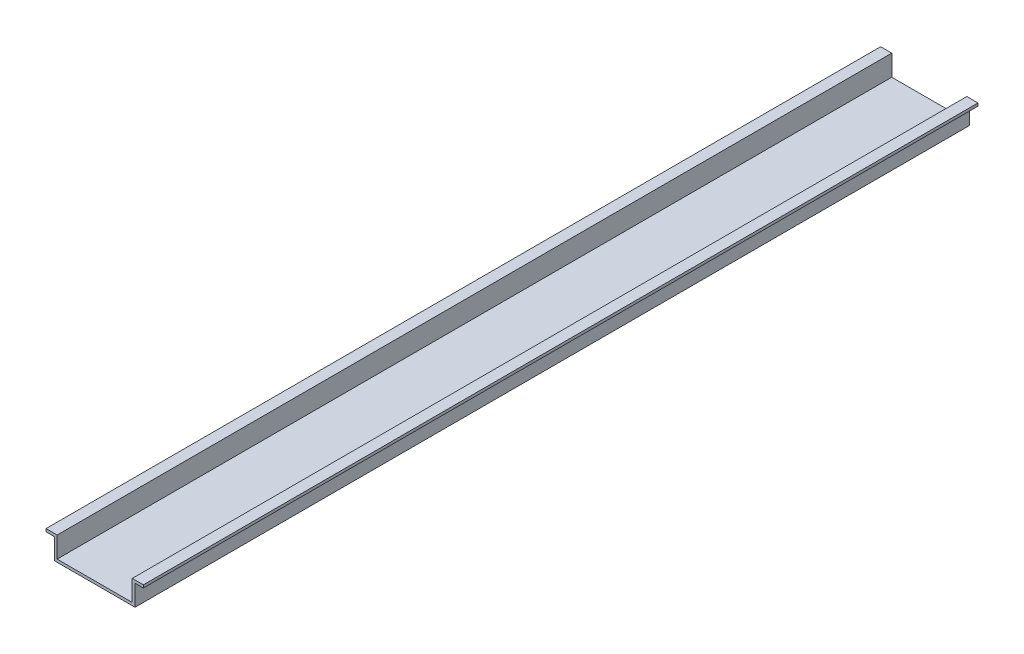
ISO-10303-21;
HEADER;
FILE_DESCRIPTION(('STEP AP214'),'2;1');
FILE_NAME('part.step','',(''),(''),'','','');
FILE_SCHEMA(('AUTOMOTIVE_DESIGN { 1 0 10303 214 1 1 1 1 }'));
ENDSEC;
DATA;
#1=APPLICATION_CONTEXT('core data for automotive mechanical design processes');
#2=APPLICATION_PROTOCOL_DEFINITION('international standard','automotive_design',2000,#1);
#3=PRODUCT_CONTEXT('',#1,'mechanical');
#4=PRODUCT('Part','Part','',(#3));
#5=PRODUCT_RELATED_PRODUCT_CATEGORY('part','',(#4));
#6=PRODUCT_DEFINITION_FORMATION('','',#4);
#7=PRODUCT_DEFINITION_CONTEXT('part definition',#1,'design');
#8=PRODUCT_DEFINITION('design','',#6,#7);
#9=PRODUCT_DEFINITION_SHAPE('','',#8);
#10=(LENGTH_UNIT() NAMED_UNIT(*) SI_UNIT(.MILLI.,.METRE.));
#11=(NAMED_UNIT(*) PLANE_ANGLE_UNIT() SI_UNIT($,.RADIAN.));
#12=(NAMED_UNIT(*) SI_UNIT($,.STERADIAN.) SOLID_ANGLE_UNIT());
#13=UNCERTAINTY_MEASURE_WITH_UNIT(LENGTH_MEASURE(1.E-05),#10,'distance_accuracy_value','');
#14=(GEOMETRIC_REPRESENTATION_CONTEXT(3) GLOBAL_UNCERTAINTY_ASSIGNED_CONTEXT((#13)) GLOBAL_UNIT_ASSIGNED_CONTEXT((#10,
#11,#12)) REPRESENTATION_CONTEXT('',''));
#15=CARTESIAN_POINT('',(0.,0.,0.));
#16=DIRECTION('',(0.,0.,1.));
#17=DIRECTION('',(1.,0.,0.));
#18=AXIS2_PLACEMENT_3D('',#15,#16,#17);
#19=CARTESIAN_POINT('',(13.5,6.49999999999999,150.));
#20=DIRECTION('',(0.,1.,0.));
#21=DIRECTION('',(-1.,0.,0.));
#22=AXIS2_PLACEMENT_3D('',#19,#20,#21);
#23=PLANE('',#22);
#24=DIRECTION('',(1.,0.,0.));
#25=VECTOR('',#24,1.);
#26=CARTESIAN_POINT('',(13.5,6.49999999999999,-150.));
#27=LINE('',#26,#25);
#28=CARTESIAN_POINT('',(14.5,6.49999999999999,-150.));
#29=VERTEX_POINT('',#28);
#30=CARTESIAN_POINT('',(17.5,6.49999999999999,-150.));
#31=VERTEX_POINT('',#30);
#32=EDGE_CURVE('E157',#29,#31,#27,.T.);
#33=ORIENTED_EDGE('',*,*,#32,.T.);
#34=DIRECTION('',(0.,0.,-1.));
#35=VECTOR('',#34,1.);
#36=CARTESIAN_POINT('',(17.5,6.49999999999999,150.));
#37=LINE('',#36,#35);
#38=CARTESIAN_POINT('',(17.5,6.49999999999999,150.));
#39=VERTEX_POINT('',#38);
#40=EDGE_CURVE('E11',#39,#31,#37,.T.);
#41=ORIENTED_EDGE('',*,*,#40,.F.);
#42=DIRECTION('',(1.,0.,0.));
#43=VECTOR('',#42,1.);
#44=CARTESIAN_POINT('',(13.5,6.49999999999999,150.));
#45=LINE('',#44,#43);
#46=CARTESIAN_POINT('',(14.5,6.49999999999999,150.));
#47=VERTEX_POINT('',#46);
#48=EDGE_CURVE('E105',#47,#39,#45,.T.);
#49=ORIENTED_EDGE('',*,*,#48,.F.);
#50=DIRECTION('',(0.,0.,-1.));
#51=VECTOR('',#50,1.);
#52=CARTESIAN_POINT('',(14.5,6.49999999999999,150.));
#53=LINE('',#52,#51);
#54=EDGE_CURVE('E153',#47,#29,#53,.T.);
#55=ORIENTED_EDGE('',*,*,#54,.T.);
#56=EDGE_LOOP('',(#33,#41,#49,#55));
#57=FACE_BOUND('',#56,.T.);
#58=ADVANCED_FACE('F37',(#57),#23,.F.);
#59=CARTESIAN_POINT('',(17.5,7.49999999999999,150.));
#60=DIRECTION('',(1.,0.,0.));
#61=DIRECTION('',(0.,0.,-1.));
#62=AXIS2_PLACEMENT_3D('',#59,#60,#61);
#63=PLANE('',#62);
#64=DIRECTION('',(0.,-1.,0.));
#65=VECTOR('',#64,1.);
#66=CARTESIAN_POINT('',(17.5,7.49999999999999,-150.));
#67=LINE('',#66,#65);
#68=CARTESIAN_POINT('',(17.5,7.49999999999999,-150.));
#69=VERTEX_POINT('',#68);
#70=EDGE_CURVE('E160',#69,#31,#67,.T.);
#71=ORIENTED_EDGE('',*,*,#70,.F.);
#72=DIRECTION('',(0.,0.,-1.));
#73=VECTOR('',#72,1.);
#74=CARTESIAN_POINT('',(17.5,7.49999999999999,150.));
#75=LINE('',#74,#73);
#76=CARTESIAN_POINT('',(17.5,7.49999999999999,150.));
#77=VERTEX_POINT('',#76);
#78=EDGE_CURVE('E45',#77,#69,#75,.T.);
#79=ORIENTED_EDGE('',*,*,#78,.F.);
#80=DIRECTION('',(0.,-1.,0.));
#81=VECTOR('',#80,1.);
#82=CARTESIAN_POINT('',(17.5,7.49999999999999,150.));
#83=LINE('',#82,#81);
#84=EDGE_CURVE('E222',#77,#39,#83,.T.);
#85=ORIENTED_EDGE('',*,*,#84,.T.);
#86=ORIENTED_EDGE('',*,*,#40,.T.);
#87=EDGE_LOOP('',(#71,#79,#85,#86));
#88=FACE_BOUND('',#87,.T.);
#89=ADVANCED_FACE('F209',(#88),#63,.T.);
#90=CARTESIAN_POINT('',(13.5,7.49999999999999,150.));
#91=DIRECTION('',(0.,1.,0.));
#92=DIRECTION('',(-1.,0.,0.));
#93=AXIS2_PLACEMENT_3D('',#90,#91,#92);
#94=PLANE('',#93);
#95=DIRECTION('',(1.,0.,0.));
#96=VECTOR('',#95,1.);
#97=CARTESIAN_POINT('',(13.5,7.49999999999999,-150.));
#98=LINE('',#97,#96);
#99=CARTESIAN_POINT('',(13.5,7.49999999999999,-150.));
#100=VERTEX_POINT('',#99);
#101=EDGE_CURVE('E163',#100,#69,#98,.T.);
#102=ORIENTED_EDGE('',*,*,#101,.F.);
#103=DIRECTION('',(0.,0.,-1.));
#104=VECTOR('',#103,1.);
#105=CARTESIAN_POINT('',(13.5,7.49999999999999,150.));
#106=LINE('',#105,#104);
#107=CARTESIAN_POINT('',(13.5,7.49999999999999,150.));
#108=VERTEX_POINT('',#107);
#109=EDGE_CURVE('E199',#108,#100,#106,.T.);
#110=ORIENTED_EDGE('',*,*,#109,.F.);
#111=DIRECTION('',(1.,0.,0.));
#112=VECTOR('',#111,1.);
#113=CARTESIAN_POINT('',(13.5,7.49999999999999,150.));
#114=LINE('',#113,#112);
#115=EDGE_CURVE('E206',#108,#77,#114,.T.);
#116=ORIENTED_EDGE('',*,*,#115,.T.);
#117=ORIENTED_EDGE('',*,*,#78,.T.);
#118=EDGE_LOOP('',(#102,#110,#116,#117));
#119=FACE_BOUND('',#118,.T.);
#120=ADVANCED_FACE('F204',(#119),#94,.T.);
#121=CARTESIAN_POINT('',(13.5,0.,150.));
#122=DIRECTION('',(-1.,0.,0.));
#123=DIRECTION('',(0.,0.,1.));
#124=AXIS2_PLACEMENT_3D('',#121,#122,#123);
#125=PLANE('',#124);
#126=DIRECTION('',(0.,1.,0.));
#127=VECTOR('',#126,1.);
#128=CARTESIAN_POINT('',(13.5,0.,-150.));
#129=LINE('',#128,#127);
#130=CARTESIAN_POINT('',(13.5,0.,-150.));
#131=VERTEX_POINT('',#130);
#132=EDGE_CURVE('E166',#131,#100,#129,.T.);
#133=ORIENTED_EDGE('',*,*,#132,.F.);
#134=DIRECTION('',(0.,0.,-1.));
#135=VECTOR('',#134,1.);
#136=CARTESIAN_POINT('',(13.5,0.,150.));
#137=LINE('',#136,#135);
#138=CARTESIAN_POINT('',(13.5,0.,150.));
#139=VERTEX_POINT('',#138);
#140=EDGE_CURVE('E197',#139,#131,#137,.T.);
#141=ORIENTED_EDGE('',*,*,#140,.F.);
#142=DIRECTION('',(0.,1.,0.));
#143=VECTOR('',#142,1.);
#144=CARTESIAN_POINT('',(13.5,0.,150.));
#145=LINE('',#144,#143);
#146=EDGE_CURVE('E219',#139,#108,#145,.T.);
#147=ORIENTED_EDGE('',*,*,#146,.T.);
#148=ORIENTED_EDGE('',*,*,#109,.T.);
#149=EDGE_LOOP('',(#133,#141,#147,#148));
#150=FACE_BOUND('',#149,.T.);
#151=ADVANCED_FACE('F216',(#150),#125,.T.);
#152=CARTESIAN_POINT('',(13.5,0.,150.));
#153=DIRECTION('',(0.,1.,0.));
#154=DIRECTION('',(0.,0.,1.));
#155=AXIS2_PLACEMENT_3D('',#152,#153,#154);
#156=PLANE('',#155);
#157=DIRECTION('',(1.,0.,0.));
#158=VECTOR('',#157,1.);
#159=CARTESIAN_POINT('',(13.5,0.,-150.));
#160=LINE('',#159,#158);
#161=CARTESIAN_POINT('',(-13.5,0.,-150.));
#162=VERTEX_POINT('',#161);
#163=EDGE_CURVE('E169',#162,#131,#160,.T.);
#164=ORIENTED_EDGE('',*,*,#163,.F.);
#165=DIRECTION('',(0.,0.,-1.));
#166=VECTOR('',#165,1.);
#167=CARTESIAN_POINT('',(-13.5,0.,150.));
#168=LINE('',#167,#166);
#169=CARTESIAN_POINT('',(-13.5,0.,150.));
#170=VERTEX_POINT('',#169);
#171=EDGE_CURVE('E195',#170,#162,#168,.T.);
#172=ORIENTED_EDGE('',*,*,#171,.F.);
#173=DIRECTION('',(1.,0.,0.));
#174=VECTOR('',#173,1.);
#175=CARTESIAN_POINT('',(13.5,0.,150.));
#176=LINE('',#175,#174);
#177=EDGE_CURVE('E224',#170,#139,#176,.T.);
#178=ORIENTED_EDGE('',*,*,#177,.T.);
#179=ORIENTED_EDGE('',*,*,#140,.T.);
#180=EDGE_LOOP('',(#164,#172,#178,#179));
#181=FACE_BOUND('',#180,.T.);
#182=ADVANCED_FACE('F331',(#181),#156,.T.);
#183=CARTESIAN_POINT('',(-13.5,0.,150.));
#184=DIRECTION('',(1.,0.,0.));
#185=DIRECTION('',(0.,0.,-1.));
#186=AXIS2_PLACEMENT_3D('',#183,#184,#185);
#187=PLANE('',#186);
#188=DIRECTION('',(0.,-1.,0.));
#189=VECTOR('',#188,1.);
#190=CARTESIAN_POINT('',(-13.5,0.,-150.));
#191=LINE('',#190,#189);
#192=CARTESIAN_POINT('',(-13.5,7.49999999999999,-150.));
#193=VERTEX_POINT('',#192);
#194=EDGE_CURVE('E172',#193,#162,#191,.T.);
#195=ORIENTED_EDGE('',*,*,#194,.F.);
#196=DIRECTION('',(0.,0.,-1.));
#197=VECTOR('',#196,1.);
#198=CARTESIAN_POINT('',(-13.5,7.49999999999999,150.));
#199=LINE('',#198,#197);
#200=CARTESIAN_POINT('',(-13.5,7.49999999999999,150.));
#201=VERTEX_POINT('',#200);
#202=EDGE_CURVE('E193',#201,#193,#199,.T.);
#203=ORIENTED_EDGE('',*,*,#202,.F.);
#204=DIRECTION('',(0.,-1.,0.));
#205=VECTOR('',#204,1.);
#206=CARTESIAN_POINT('',(-13.5,0.,150.));
#207=LINE('',#206,#205);
#208=EDGE_CURVE('E230',#201,#170,#207,.T.);
#209=ORIENTED_EDGE('',*,*,#208,.T.);
#210=ORIENTED_EDGE('',*,*,#171,.T.);
#211=EDGE_LOOP('',(#195,#203,#209,#210));
#212=FACE_BOUND('',#211,.T.);
#213=ADVANCED_FACE('F321',(#212),#187,.T.);
#214=CARTESIAN_POINT('',(-13.5,7.49999999999999,150.));
#215=DIRECTION('',(0.,1.,0.));
#216=DIRECTION('',(-1.,0.,0.));
#217=AXIS2_PLACEMENT_3D('',#214,#215,#216);
#218=PLANE('',#217);
#219=DIRECTION('',(1.,0.,0.));
#220=VECTOR('',#219,1.);
#221=CARTESIAN_POINT('',(-13.5,7.49999999999999,-150.));
#222=LINE('',#221,#220);
#223=CARTESIAN_POINT('',(-17.5,7.49999999999999,-150.));
#224=VERTEX_POINT('',#223);
#225=EDGE_CURVE('E175',#224,#193,#222,.T.);
#226=ORIENTED_EDGE('',*,*,#225,.F.);
#227=DIRECTION('',(0.,0.,-1.));
#228=VECTOR('',#227,1.);
#229=CARTESIAN_POINT('',(-17.5,7.49999999999999,150.));
#230=LINE('',#229,#228);
#231=CARTESIAN_POINT('',(-17.5,7.49999999999999,150.));
#232=VERTEX_POINT('',#231);
#233=EDGE_CURVE('E191',#232,#224,#230,.T.);
#234=ORIENTED_EDGE('',*,*,#233,.F.);
#235=DIRECTION('',(1.,0.,0.));
#236=VECTOR('',#235,1.);
#237=CARTESIAN_POINT('',(-13.5,7.49999999999999,150.));
#238=LINE('',#237,#236);
#239=EDGE_CURVE('E233',#232,#201,#238,.T.);
#240=ORIENTED_EDGE('',*,*,#239,.T.);
#241=ORIENTED_EDGE('',*,*,#202,.T.);
#242=EDGE_LOOP('',(#226,#234,#240,#241));
#243=FACE_BOUND('',#242,.T.);
#244=ADVANCED_FACE('F245',(#243),#218,.T.);
#245=CARTESIAN_POINT('',(-17.5,6.49999999999999,150.));
#246=DIRECTION('',(-1.,0.,0.));
#247=DIRECTION('',(0.,0.,1.));
#248=AXIS2_PLACEMENT_3D('',#245,#246,#247);
#249=PLANE('',#248);
#250=DIRECTION('',(0.,1.,0.));
#251=VECTOR('',#250,1.);
#252=CARTESIAN_POINT('',(-17.5,6.49999999999999,-150.));
#253=LINE('',#252,#251);
#254=CARTESIAN_POINT('',(-17.5,6.49999999999999,-150.));
#255=VERTEX_POINT('',#254);
#256=EDGE_CURVE('E178',#255,#224,#253,.T.);
#257=ORIENTED_EDGE('',*,*,#256,.F.);
#258=DIRECTION('',(0.,0.,-1.));
#259=VECTOR('',#258,1.);
#260=CARTESIAN_POINT('',(-17.5,6.49999999999999,150.));
#261=LINE('',#260,#259);
#262=CARTESIAN_POINT('',(-17.5,6.49999999999999,150.));
#263=VERTEX_POINT('',#262);
#264=EDGE_CURVE('E189',#263,#255,#261,.T.);
#265=ORIENTED_EDGE('',*,*,#264,.F.);
#266=DIRECTION('',(0.,1.,0.));
#267=VECTOR('',#266,1.);
#268=CARTESIAN_POINT('',(-17.5,6.49999999999999,150.));
#269=LINE('',#268,#267);
#270=EDGE_CURVE('E236',#263,#232,#269,.T.);
#271=ORIENTED_EDGE('',*,*,#270,.T.);
#272=ORIENTED_EDGE('',*,*,#233,.T.);
#273=EDGE_LOOP('',(#257,#265,#271,#272));
#274=FACE_BOUND('',#273,.T.);
#275=ADVANCED_FACE('F240',(#274),#249,.T.);
#276=CARTESIAN_POINT('',(-13.5,6.49999999999999,150.));
#277=DIRECTION('',(0.,1.,0.));
#278=DIRECTION('',(-1.,0.,0.));
#279=AXIS2_PLACEMENT_3D('',#276,#277,#278);
#280=PLANE('',#279);
#281=DIRECTION('',(1.,0.,0.));
#282=VECTOR('',#281,1.);
#283=CARTESIAN_POINT('',(-13.5,6.49999999999999,-150.));
#284=LINE('',#283,#282);
#285=CARTESIAN_POINT('',(-14.5,6.49999999999999,-150.));
#286=VERTEX_POINT('',#285);
#287=EDGE_CURVE('E181',#255,#286,#284,.T.);
#288=ORIENTED_EDGE('',*,*,#287,.T.);
#289=DIRECTION('',(0.,0.,-1.));
#290=VECTOR('',#289,1.);
#291=CARTESIAN_POINT('',(-14.5,6.49999999999999,150.));
#292=LINE('',#291,#290);
#293=CARTESIAN_POINT('',(-14.5,6.49999999999999,150.));
#294=VERTEX_POINT('',#293);
#295=EDGE_CURVE('E148',#294,#286,#292,.T.);
#296=ORIENTED_EDGE('',*,*,#295,.F.);
#297=DIRECTION('',(1.,0.,0.));
#298=VECTOR('',#297,1.);
#299=CARTESIAN_POINT('',(-13.5,6.49999999999999,150.));
#300=LINE('',#299,#298);
#301=EDGE_CURVE('E139',#263,#294,#300,.T.);
#302=ORIENTED_EDGE('',*,*,#301,.F.);
#303=ORIENTED_EDGE('',*,*,#264,.T.);
#304=EDGE_LOOP('',(#288,#296,#302,#303));
#305=FACE_BOUND('',#304,.T.);
#306=ADVANCED_FACE('F249',(#305),#280,.F.);
#307=CARTESIAN_POINT('',(-14.5,0.,150.));
#308=DIRECTION('',(1.,0.,0.));
#309=DIRECTION('',(0.,0.,-1.));
#310=AXIS2_PLACEMENT_3D('',#307,#308,#309);
#311=PLANE('',#310);
#312=DIRECTION('',(0.,1.,0.));
#313=VECTOR('',#312,1.);
#314=CARTESIAN_POINT('',(-14.5,0.,-150.));
#315=LINE('',#314,#313);
#316=CARTESIAN_POINT('',(-14.5,-1.,-150.));
#317=VERTEX_POINT('',#316);
#318=EDGE_CURVE('E147',#286,#317,#315,.F.);
#319=ORIENTED_EDGE('',*,*,#318,.T.);
#320=DIRECTION('',(0.,0.,-1.));
#321=VECTOR('',#320,1.);
#322=CARTESIAN_POINT('',(-14.5,-1.,150.));
#323=LINE('',#322,#321);
#324=CARTESIAN_POINT('',(-14.5,-1.,150.));
#325=VERTEX_POINT('',#324);
#326=EDGE_CURVE('E144',#325,#317,#323,.T.);
#327=ORIENTED_EDGE('',*,*,#326,.F.);
#328=DIRECTION('',(0.,1.,0.));
#329=VECTOR('',#328,1.);
#330=CARTESIAN_POINT('',(-14.5,0.,150.));
#331=LINE('',#330,#329);
#332=EDGE_CURVE('E132',#294,#325,#331,.F.);
#333=ORIENTED_EDGE('',*,*,#332,.F.);
#334=ORIENTED_EDGE('',*,*,#295,.T.);
#335=EDGE_LOOP('',(#319,#327,#333,#334));
#336=FACE_BOUND('',#335,.T.);
#337=ADVANCED_FACE('F145',(#336),#311,.F.);
#338=CARTESIAN_POINT('',(13.5,-1.,150.));
#339=DIRECTION('',(0.,1.,0.));
#340=DIRECTION('',(0.,0.,1.));
#341=AXIS2_PLACEMENT_3D('',#338,#339,#340);
#342=PLANE('',#341);
#343=DIRECTION('',(1.,0.,0.));
#344=VECTOR('',#343,1.);
#345=CARTESIAN_POINT('',(13.5,-1.,-150.));
#346=LINE('',#345,#344);
#347=CARTESIAN_POINT('',(14.5,-1.,-150.));
#348=VERTEX_POINT('',#347);
#349=EDGE_CURVE('E93',#317,#348,#346,.T.);
#350=ORIENTED_EDGE('',*,*,#349,.T.);
#351=DIRECTION('',(0.,0.,-1.));
#352=VECTOR('',#351,1.);
#353=CARTESIAN_POINT('',(14.5,-1.,150.));
#354=LINE('',#353,#352);
#355=CARTESIAN_POINT('',(14.5,-1.,150.));
#356=VERTEX_POINT('',#355);
#357=EDGE_CURVE('E149',#356,#348,#354,.T.);
#358=ORIENTED_EDGE('',*,*,#357,.F.);
#359=DIRECTION('',(1.,0.,0.));
#360=VECTOR('',#359,1.);
#361=CARTESIAN_POINT('',(13.5,-1.,150.));
#362=LINE('',#361,#360);
#363=EDGE_CURVE('E136',#325,#356,#362,.T.);
#364=ORIENTED_EDGE('',*,*,#363,.F.);
#365=ORIENTED_EDGE('',*,*,#326,.T.);
#366=EDGE_LOOP('',(#350,#358,#364,#365));
#367=FACE_BOUND('',#366,.T.);
#368=ADVANCED_FACE('F151',(#367),#342,.F.);
#369=CARTESIAN_POINT('',(14.5,0.,150.));
#370=DIRECTION('',(-1.,0.,0.));
#371=DIRECTION('',(0.,0.,1.));
#372=AXIS2_PLACEMENT_3D('',#369,#370,#371);
#373=PLANE('',#372);
#374=DIRECTION('',(0.,1.,0.));
#375=VECTOR('',#374,1.);
#376=CARTESIAN_POINT('',(14.5,0.,-150.));
#377=LINE('',#376,#375);
#378=EDGE_CURVE('E99',#348,#29,#377,.T.);
#379=ORIENTED_EDGE('',*,*,#378,.T.);
#380=ORIENTED_EDGE('',*,*,#54,.F.);
#381=DIRECTION('',(0.,1.,0.));
#382=VECTOR('',#381,1.);
#383=CARTESIAN_POINT('',(14.5,0.,150.));
#384=LINE('',#383,#382);
#385=EDGE_CURVE('E53',#356,#47,#384,.T.);
#386=ORIENTED_EDGE('',*,*,#385,.F.);
#387=ORIENTED_EDGE('',*,*,#357,.T.);
#388=EDGE_LOOP('',(#379,#380,#386,#387));
#389=FACE_BOUND('',#388,.T.);
#390=ADVANCED_FACE('F263',(#389),#373,.F.);
#391=CARTESIAN_POINT('',(0.,0.,150.));
#392=DIRECTION('',(0.,0.,-1.));
#393=DIRECTION('',(-1.,0.,0.));
#394=AXIS2_PLACEMENT_3D('',#391,#392,#393);
#395=PLANE('',#394);
#396=ORIENTED_EDGE('',*,*,#48,.T.);
#397=ORIENTED_EDGE('',*,*,#84,.F.);
#398=ORIENTED_EDGE('',*,*,#115,.F.);
#399=ORIENTED_EDGE('',*,*,#146,.F.);
#400=ORIENTED_EDGE('',*,*,#177,.F.);
#401=ORIENTED_EDGE('',*,*,#208,.F.);
#402=ORIENTED_EDGE('',*,*,#239,.F.);
#403=ORIENTED_EDGE('',*,*,#270,.F.);
#404=ORIENTED_EDGE('',*,*,#301,.T.);
#405=ORIENTED_EDGE('',*,*,#332,.T.);
#406=ORIENTED_EDGE('',*,*,#363,.T.);
#407=ORIENTED_EDGE('',*,*,#385,.T.);
#408=EDGE_LOOP('',(#396,#397,#398,#399,#400,#401,#402,#403,#404,#405,#406,#407));
#409=FACE_BOUND('',#408,.T.);
#410=ADVANCED_FACE('F134',(#409),#395,.F.);
#411=CARTESIAN_POINT('',(0.,0.,-150.));
#412=DIRECTION('',(0.,0.,-1.));
#413=DIRECTION('',(-1.,0.,0.));
#414=AXIS2_PLACEMENT_3D('',#411,#412,#413);
#415=PLANE('',#414);
#416=ORIENTED_EDGE('',*,*,#32,.F.);
#417=ORIENTED_EDGE('',*,*,#378,.F.);
#418=ORIENTED_EDGE('',*,*,#349,.F.);
#419=ORIENTED_EDGE('',*,*,#318,.F.);
#420=ORIENTED_EDGE('',*,*,#287,.F.);
#421=ORIENTED_EDGE('',*,*,#256,.T.);
#422=ORIENTED_EDGE('',*,*,#225,.T.);
#423=ORIENTED_EDGE('',*,*,#194,.T.);
#424=ORIENTED_EDGE('',*,*,#163,.T.);
#425=ORIENTED_EDGE('',*,*,#132,.T.);
#426=ORIENTED_EDGE('',*,*,#101,.T.);
#427=ORIENTED_EDGE('',*,*,#70,.T.);
#428=EDGE_LOOP('',(#416,#417,#418,#419,#420,#421,#422,#423,#424,#425,#426,#427));
#429=FACE_BOUND('',#428,.T.);
#430=ADVANCED_FACE('F212',(#429),#415,.T.);
#431=CLOSED_SHELL('',(#58,#89,#120,#151,#182,#213,#244,#275,#306,#337,#368,#390,#410,#430));
#432=MANIFOLD_SOLID_BREP('B2',#431);
#433=ADVANCED_BREP_SHAPE_REPRESENTATION('',(#18,#432),#14);
#434=SHAPE_DEFINITION_REPRESENTATION(#9,#433);
ENDSEC;
END-ISO-10303-21;
